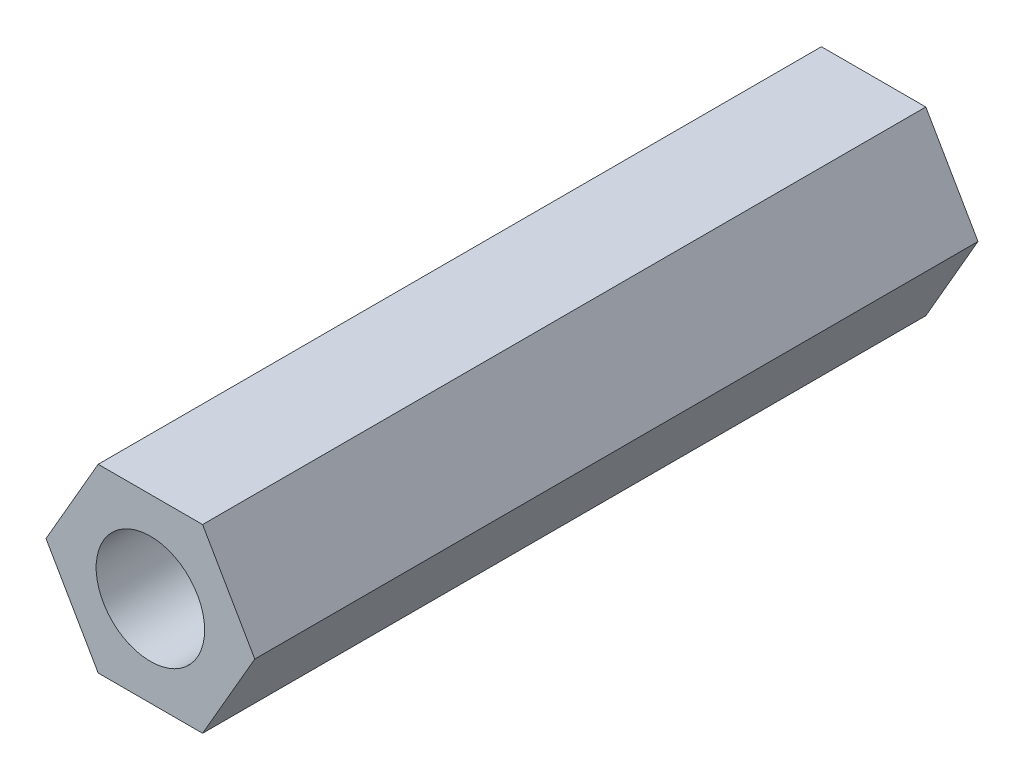
ISO-10303-21;
HEADER;
FILE_DESCRIPTION(('STEP AP214'),'2;1');
FILE_NAME('part.step','',(''),(''),'','','');
FILE_SCHEMA(('AUTOMOTIVE_DESIGN { 1 0 10303 214 1 1 1 1 }'));
ENDSEC;
DATA;
#1=APPLICATION_CONTEXT('core data for automotive mechanical design processes');
#2=APPLICATION_PROTOCOL_DEFINITION('international standard','automotive_design',2000,#1);
#3=PRODUCT_CONTEXT('',#1,'mechanical');
#4=PRODUCT('Part','Part','',(#3));
#5=PRODUCT_RELATED_PRODUCT_CATEGORY('part','',(#4));
#6=PRODUCT_DEFINITION_FORMATION('','',#4);
#7=PRODUCT_DEFINITION_CONTEXT('part definition',#1,'design');
#8=PRODUCT_DEFINITION('design','',#6,#7);
#9=PRODUCT_DEFINITION_SHAPE('','',#8);
#10=(LENGTH_UNIT() NAMED_UNIT(*) SI_UNIT(.MILLI.,.METRE.));
#11=(NAMED_UNIT(*) PLANE_ANGLE_UNIT() SI_UNIT($,.RADIAN.));
#12=(NAMED_UNIT(*) SI_UNIT($,.STERADIAN.) SOLID_ANGLE_UNIT());
#13=UNCERTAINTY_MEASURE_WITH_UNIT(LENGTH_MEASURE(1.E-05),#10,'distance_accuracy_value','');
#14=(GEOMETRIC_REPRESENTATION_CONTEXT(3) GLOBAL_UNCERTAINTY_ASSIGNED_CONTEXT((#13)) GLOBAL_UNIT_ASSIGNED_CONTEXT((#10,
#11,#12)) REPRESENTATION_CONTEXT('',''));
#15=CARTESIAN_POINT('',(0.,0.,0.));
#16=DIRECTION('',(0.,0.,1.));
#17=DIRECTION('',(1.,0.,0.));
#18=AXIS2_PLACEMENT_3D('',#15,#16,#17);
#19=CARTESIAN_POINT('',(1.44337567297407,2.50000000000001,20.));
#20=DIRECTION('',(0.,0.,1.));
#21=DIRECTION('',(1.,0.,0.));
#22=AXIS2_PLACEMENT_3D('',#19,#20,#21);
#23=PLANE('',#22);
#24=DIRECTION('',(-0.5,0.866025403784439,0.));
#25=VECTOR('',#24,1.);
#26=CARTESIAN_POINT('',(2.88675134594814,0.,20.));
#27=LINE('',#26,#25);
#28=CARTESIAN_POINT('',(2.88675134594814,0.,20.));
#29=VERTEX_POINT('',#28);
#30=CARTESIAN_POINT('',(1.44337567297407,2.50000000000001,20.));
#31=VERTEX_POINT('',#30);
#32=EDGE_CURVE('E126',#29,#31,#27,.T.);
#33=ORIENTED_EDGE('',*,*,#32,.T.);
#34=DIRECTION('',(-1.,0.,0.));
#35=VECTOR('',#34,1.);
#36=CARTESIAN_POINT('',(1.44337567297407,2.50000000000001,20.));
#37=LINE('',#36,#35);
#38=CARTESIAN_POINT('',(-1.44337567297407,2.50000000000001,20.));
#39=VERTEX_POINT('',#38);
#40=EDGE_CURVE('E84',#31,#39,#37,.T.);
#41=ORIENTED_EDGE('',*,*,#40,.T.);
#42=DIRECTION('',(-0.5,-0.866025403784439,0.));
#43=VECTOR('',#42,1.);
#44=CARTESIAN_POINT('',(-1.44337567297407,2.50000000000001,20.));
#45=LINE('',#44,#43);
#46=CARTESIAN_POINT('',(-2.88675134594813,0.,20.));
#47=VERTEX_POINT('',#46);
#48=EDGE_CURVE('E97',#39,#47,#45,.T.);
#49=ORIENTED_EDGE('',*,*,#48,.T.);
#50=DIRECTION('',(0.5,-0.866025403784439,0.));
#51=VECTOR('',#50,1.);
#52=CARTESIAN_POINT('',(-2.88675134594813,0.,20.));
#53=LINE('',#52,#51);
#54=CARTESIAN_POINT('',(-1.44337567297407,-2.5,20.));
#55=VERTEX_POINT('',#54);
#56=EDGE_CURVE('E91',#47,#55,#53,.T.);
#57=ORIENTED_EDGE('',*,*,#56,.T.);
#58=DIRECTION('',(1.,0.,0.));
#59=VECTOR('',#58,1.);
#60=CARTESIAN_POINT('',(-1.44337567297407,-2.5,20.));
#61=LINE('',#60,#59);
#62=CARTESIAN_POINT('',(1.44337567297407,-2.50000000000001,20.));
#63=VERTEX_POINT('',#62);
#64=EDGE_CURVE('E95',#55,#63,#61,.T.);
#65=ORIENTED_EDGE('',*,*,#64,.T.);
#66=DIRECTION('',(0.5,0.866025403784438,0.));
#67=VECTOR('',#66,1.);
#68=CARTESIAN_POINT('',(1.44337567297407,-2.50000000000001,20.));
#69=LINE('',#68,#67);
#70=EDGE_CURVE('E47',#63,#29,#69,.T.);
#71=ORIENTED_EDGE('',*,*,#70,.T.);
#72=EDGE_LOOP('',(#33,#41,#49,#57,#65,#71));
#73=FACE_BOUND('',#72,.T.);
#74=CARTESIAN_POINT('',(0.,0.,20.));
#75=DIRECTION('',(0.,0.,1.));
#76=DIRECTION('',(1.,0.,0.));
#77=AXIS2_PLACEMENT_3D('',#74,#75,#76);
#78=CIRCLE('',#77,1.5);
#79=CARTESIAN_POINT('',(1.5,0.,20.));
#80=VERTEX_POINT('',#79);
#81=EDGE_CURVE('E119',#80,#80,#78,.T.);
#82=ORIENTED_EDGE('',*,*,#81,.F.);
#83=EDGE_LOOP('',(#82));
#84=FACE_BOUND('',#83,.T.);
#85=ADVANCED_FACE('F30',(#73,#84),#23,.T.);
#86=CARTESIAN_POINT('',(1.44337567297407,2.50000000000001,0.));
#87=DIRECTION('',(0.,0.,1.));
#88=DIRECTION('',(1.,0.,0.));
#89=AXIS2_PLACEMENT_3D('',#86,#87,#88);
#90=PLANE('',#89);
#91=DIRECTION('',(-0.5,0.866025403784439,0.));
#92=VECTOR('',#91,1.);
#93=CARTESIAN_POINT('',(2.88675134594814,0.,0.));
#94=LINE('',#93,#92);
#95=CARTESIAN_POINT('',(2.88675134594814,0.,0.));
#96=VERTEX_POINT('',#95);
#97=CARTESIAN_POINT('',(1.44337567297407,2.50000000000001,0.));
#98=VERTEX_POINT('',#97);
#99=EDGE_CURVE('E115',#96,#98,#94,.T.);
#100=ORIENTED_EDGE('',*,*,#99,.F.);
#101=DIRECTION('',(0.5,0.866025403784438,0.));
#102=VECTOR('',#101,1.);
#103=CARTESIAN_POINT('',(1.44337567297407,-2.50000000000001,0.));
#104=LINE('',#103,#102);
#105=CARTESIAN_POINT('',(1.44337567297407,-2.50000000000001,0.));
#106=VERTEX_POINT('',#105);
#107=EDGE_CURVE('E76',#106,#96,#104,.T.);
#108=ORIENTED_EDGE('',*,*,#107,.F.);
#109=DIRECTION('',(1.,0.,0.));
#110=VECTOR('',#109,1.);
#111=CARTESIAN_POINT('',(-1.44337567297407,-2.5,0.));
#112=LINE('',#111,#110);
#113=CARTESIAN_POINT('',(-1.44337567297407,-2.5,0.));
#114=VERTEX_POINT('',#113);
#115=EDGE_CURVE('E70',#114,#106,#112,.T.);
#116=ORIENTED_EDGE('',*,*,#115,.F.);
#117=DIRECTION('',(0.5,-0.866025403784439,0.));
#118=VECTOR('',#117,1.);
#119=CARTESIAN_POINT('',(-2.88675134594813,0.,0.));
#120=LINE('',#119,#118);
#121=CARTESIAN_POINT('',(-2.88675134594813,0.,0.));
#122=VERTEX_POINT('',#121);
#123=EDGE_CURVE('E105',#122,#114,#120,.T.);
#124=ORIENTED_EDGE('',*,*,#123,.F.);
#125=DIRECTION('',(-0.5,-0.866025403784439,0.));
#126=VECTOR('',#125,1.);
#127=CARTESIAN_POINT('',(-1.44337567297407,2.50000000000001,0.));
#128=LINE('',#127,#126);
#129=CARTESIAN_POINT('',(-1.44337567297407,2.50000000000001,0.));
#130=VERTEX_POINT('',#129);
#131=EDGE_CURVE('E121',#130,#122,#128,.T.);
#132=ORIENTED_EDGE('',*,*,#131,.F.);
#133=DIRECTION('',(-1.,0.,0.));
#134=VECTOR('',#133,1.);
#135=CARTESIAN_POINT('',(1.44337567297407,2.50000000000001,0.));
#136=LINE('',#135,#134);
#137=EDGE_CURVE('E118',#98,#130,#136,.T.);
#138=ORIENTED_EDGE('',*,*,#137,.F.);
#139=EDGE_LOOP('',(#100,#108,#116,#124,#132,#138));
#140=FACE_BOUND('',#139,.T.);
#141=CARTESIAN_POINT('',(0.,0.,0.));
#142=DIRECTION('',(0.,0.,1.));
#143=DIRECTION('',(1.,0.,0.));
#144=AXIS2_PLACEMENT_3D('',#141,#142,#143);
#145=CIRCLE('',#144,1.5);
#146=CARTESIAN_POINT('',(1.5,0.,0.));
#147=VERTEX_POINT('',#146);
#148=EDGE_CURVE('E219',#147,#147,#145,.T.);
#149=ORIENTED_EDGE('',*,*,#148,.T.);
#150=EDGE_LOOP('',(#149));
#151=FACE_BOUND('',#150,.T.);
#152=ADVANCED_FACE('F135',(#140,#151),#90,.F.);
#153=CARTESIAN_POINT('',(2.88675134594814,0.,20.));
#154=DIRECTION('',(-0.866025403784439,-0.5,0.));
#155=DIRECTION('',(0.5,-0.866025403784439,0.));
#156=AXIS2_PLACEMENT_3D('',#153,#154,#155);
#157=PLANE('',#156);
#158=ORIENTED_EDGE('',*,*,#99,.T.);
#159=DIRECTION('',(0.,0.,-1.));
#160=VECTOR('',#159,1.);
#161=CARTESIAN_POINT('',(1.44337567297407,2.50000000000001,20.));
#162=LINE('',#161,#160);
#163=EDGE_CURVE('E11',#31,#98,#162,.T.);
#164=ORIENTED_EDGE('',*,*,#163,.F.);
#165=ORIENTED_EDGE('',*,*,#32,.F.);
#166=DIRECTION('',(0.,0.,-1.));
#167=VECTOR('',#166,1.);
#168=CARTESIAN_POINT('',(2.88675134594814,0.,20.));
#169=LINE('',#168,#167);
#170=EDGE_CURVE('E111',#29,#96,#169,.T.);
#171=ORIENTED_EDGE('',*,*,#170,.T.);
#172=EDGE_LOOP('',(#158,#164,#165,#171));
#173=FACE_BOUND('',#172,.T.);
#174=ADVANCED_FACE('F32',(#173),#157,.F.);
#175=CARTESIAN_POINT('',(1.44337567297407,2.50000000000001,20.));
#176=DIRECTION('',(0.,-1.,0.));
#177=DIRECTION('',(0.,0.,-1.));
#178=AXIS2_PLACEMENT_3D('',#175,#176,#177);
#179=PLANE('',#178);
#180=ORIENTED_EDGE('',*,*,#137,.T.);
#181=DIRECTION('',(0.,0.,-1.));
#182=VECTOR('',#181,1.);
#183=CARTESIAN_POINT('',(-1.44337567297407,2.50000000000001,20.));
#184=LINE('',#183,#182);
#185=EDGE_CURVE('E39',#39,#130,#184,.T.);
#186=ORIENTED_EDGE('',*,*,#185,.F.);
#187=ORIENTED_EDGE('',*,*,#40,.F.);
#188=ORIENTED_EDGE('',*,*,#163,.T.);
#189=EDGE_LOOP('',(#180,#186,#187,#188));
#190=FACE_BOUND('',#189,.T.);
#191=ADVANCED_FACE('F160',(#190),#179,.F.);
#192=CARTESIAN_POINT('',(-1.44337567297407,2.50000000000001,20.));
#193=DIRECTION('',(0.866025403784438,-0.5,0.));
#194=DIRECTION('',(0.5,0.866025403784439,0.));
#195=AXIS2_PLACEMENT_3D('',#192,#193,#194);
#196=PLANE('',#195);
#197=ORIENTED_EDGE('',*,*,#131,.T.);
#198=DIRECTION('',(0.,0.,-1.));
#199=VECTOR('',#198,1.);
#200=CARTESIAN_POINT('',(-2.88675134594813,0.,20.));
#201=LINE('',#200,#199);
#202=EDGE_CURVE('E106',#47,#122,#201,.T.);
#203=ORIENTED_EDGE('',*,*,#202,.F.);
#204=ORIENTED_EDGE('',*,*,#48,.F.);
#205=ORIENTED_EDGE('',*,*,#185,.T.);
#206=EDGE_LOOP('',(#197,#203,#204,#205));
#207=FACE_BOUND('',#206,.T.);
#208=ADVANCED_FACE('F132',(#207),#196,.F.);
#209=CARTESIAN_POINT('',(-2.88675134594813,0.,20.));
#210=DIRECTION('',(0.866025403784439,0.5,0.));
#211=DIRECTION('',(-0.5,0.866025403784439,0.));
#212=AXIS2_PLACEMENT_3D('',#209,#210,#211);
#213=PLANE('',#212);
#214=ORIENTED_EDGE('',*,*,#123,.T.);
#215=DIRECTION('',(0.,0.,-1.));
#216=VECTOR('',#215,1.);
#217=CARTESIAN_POINT('',(-1.44337567297407,-2.5,20.));
#218=LINE('',#217,#216);
#219=EDGE_CURVE('E102',#55,#114,#218,.T.);
#220=ORIENTED_EDGE('',*,*,#219,.F.);
#221=ORIENTED_EDGE('',*,*,#56,.F.);
#222=ORIENTED_EDGE('',*,*,#202,.T.);
#223=EDGE_LOOP('',(#214,#220,#221,#222));
#224=FACE_BOUND('',#223,.T.);
#225=ADVANCED_FACE('F103',(#224),#213,.F.);
#226=CARTESIAN_POINT('',(-1.44337567297407,-2.5,20.));
#227=DIRECTION('',(0.,1.,0.));
#228=DIRECTION('',(-1.,0.,0.));
#229=AXIS2_PLACEMENT_3D('',#226,#227,#228);
#230=PLANE('',#229);
#231=ORIENTED_EDGE('',*,*,#115,.T.);
#232=DIRECTION('',(0.,0.,-1.));
#233=VECTOR('',#232,1.);
#234=CARTESIAN_POINT('',(1.44337567297407,-2.50000000000001,20.));
#235=LINE('',#234,#233);
#236=EDGE_CURVE('E107',#63,#106,#235,.T.);
#237=ORIENTED_EDGE('',*,*,#236,.F.);
#238=ORIENTED_EDGE('',*,*,#64,.F.);
#239=ORIENTED_EDGE('',*,*,#219,.T.);
#240=EDGE_LOOP('',(#231,#237,#238,#239));
#241=FACE_BOUND('',#240,.T.);
#242=ADVANCED_FACE('F109',(#241),#230,.F.);
#243=CARTESIAN_POINT('',(1.44337567297407,-2.50000000000001,20.));
#244=DIRECTION('',(-0.866025403784438,0.5,0.));
#245=DIRECTION('',(-0.5,-0.866025403784438,0.));
#246=AXIS2_PLACEMENT_3D('',#243,#244,#245);
#247=PLANE('',#246);
#248=ORIENTED_EDGE('',*,*,#107,.T.);
#249=ORIENTED_EDGE('',*,*,#170,.F.);
#250=ORIENTED_EDGE('',*,*,#70,.F.);
#251=ORIENTED_EDGE('',*,*,#236,.T.);
#252=EDGE_LOOP('',(#248,#249,#250,#251));
#253=FACE_BOUND('',#252,.T.);
#254=ADVANCED_FACE('F140',(#253),#247,.F.);
#255=CARTESIAN_POINT('',(0.,0.,20.));
#256=DIRECTION('',(0.,0.,-1.));
#257=DIRECTION('',(-1.,0.,0.));
#258=AXIS2_PLACEMENT_3D('',#255,#256,#257);
#259=CYLINDRICAL_SURFACE('',#258,1.5);
#260=ORIENTED_EDGE('',*,*,#81,.T.);
#261=EDGE_LOOP('',(#260));
#262=FACE_BOUND('',#261,.T.);
#263=ORIENTED_EDGE('',*,*,#148,.F.);
#264=EDGE_LOOP('',(#263));
#265=FACE_BOUND('',#264,.T.);
#266=ADVANCED_FACE('F142',(#262,#265),#259,.F.);
#267=CLOSED_SHELL('',(#85,#152,#174,#191,#208,#225,#242,#254,#266));
#268=MANIFOLD_SOLID_BREP('B2',#267);
#269=ADVANCED_BREP_SHAPE_REPRESENTATION('',(#18,#268),#14);
#270=SHAPE_DEFINITION_REPRESENTATION(#9,#269);
ENDSEC;
END-ISO-10303-21;
